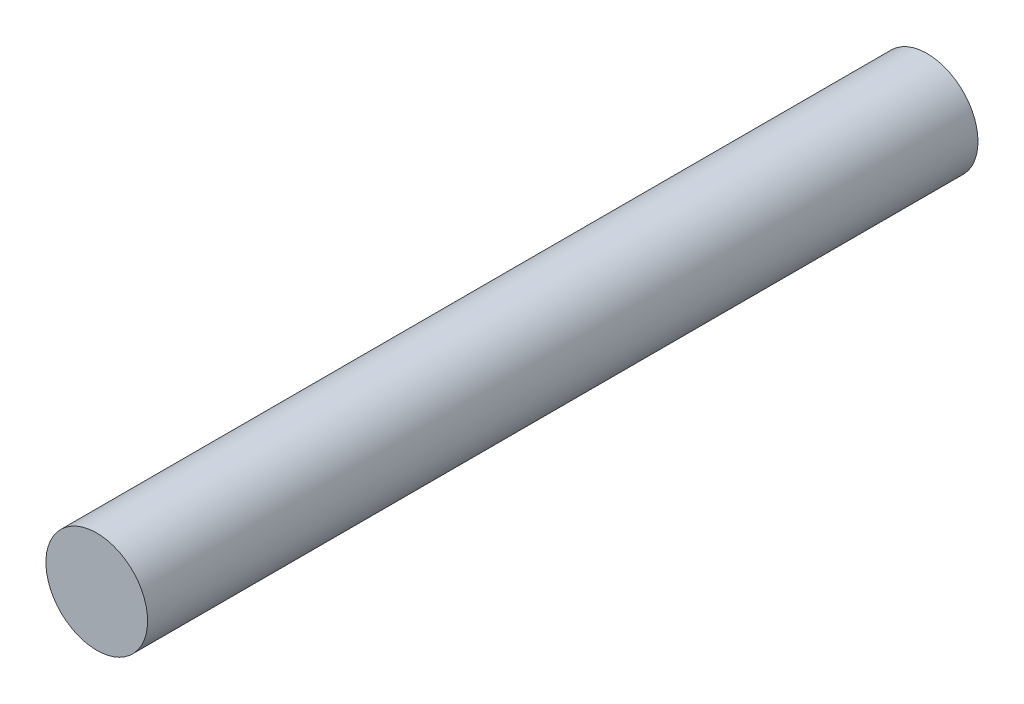
ISO-10303-21;
HEADER;
FILE_DESCRIPTION(('STEP AP214'),'2;1');
FILE_NAME('part.step','',(''),(''),'','','');
FILE_SCHEMA(('AUTOMOTIVE_DESIGN { 1 0 10303 214 1 1 1 1 }'));
ENDSEC;
DATA;
#1=APPLICATION_CONTEXT('core data for automotive mechanical design processes');
#2=APPLICATION_PROTOCOL_DEFINITION('international standard','automotive_design',2000,#1);
#3=PRODUCT_CONTEXT('',#1,'mechanical');
#4=PRODUCT('Part','Part','',(#3));
#5=PRODUCT_RELATED_PRODUCT_CATEGORY('part','',(#4));
#6=PRODUCT_DEFINITION_FORMATION('','',#4);
#7=PRODUCT_DEFINITION_CONTEXT('part definition',#1,'design');
#8=PRODUCT_DEFINITION('design','',#6,#7);
#9=PRODUCT_DEFINITION_SHAPE('','',#8);
#10=(LENGTH_UNIT() NAMED_UNIT(*) SI_UNIT(.MILLI.,.METRE.));
#11=(NAMED_UNIT(*) PLANE_ANGLE_UNIT() SI_UNIT($,.RADIAN.));
#12=(NAMED_UNIT(*) SI_UNIT($,.STERADIAN.) SOLID_ANGLE_UNIT());
#13=UNCERTAINTY_MEASURE_WITH_UNIT(LENGTH_MEASURE(1.E-05),#10,'distance_accuracy_value','');
#14=(GEOMETRIC_REPRESENTATION_CONTEXT(3) GLOBAL_UNCERTAINTY_ASSIGNED_CONTEXT((#13)) GLOBAL_UNIT_ASSIGNED_CONTEXT((#10,
#11,#12)) REPRESENTATION_CONTEXT('',''));
#15=CARTESIAN_POINT('',(0.,0.,0.));
#16=DIRECTION('',(0.,0.,1.));
#17=DIRECTION('',(1.,0.,0.));
#18=AXIS2_PLACEMENT_3D('',#15,#16,#17);
#19=CARTESIAN_POINT('',(120.626428164449,379.178369402645,24.5));
#20=DIRECTION('',(0.,0.,-1.));
#21=DIRECTION('',(-1.,0.,0.));
#22=AXIS2_PLACEMENT_3D('',#19,#20,#21);
#23=PLANE('',#22);
#24=CARTESIAN_POINT('',(120.626428164449,379.178369402645,24.5));
#25=DIRECTION('',(0.,0.,1.));
#26=DIRECTION('',(1.,0.,0.));
#27=AXIS2_PLACEMENT_3D('',#24,#25,#26);
#28=CIRCLE('',#27,1.5);
#29=CARTESIAN_POINT('',(122.126428164449,379.178369402645,24.5));
#30=VERTEX_POINT('',#29);
#31=EDGE_CURVE('E18',#30,#30,#28,.F.);
#32=ORIENTED_EDGE('',*,*,#31,.F.);
#33=EDGE_LOOP('',(#32));
#34=FACE_BOUND('',#33,.T.);
#35=ADVANCED_FACE('F15',(#34),#23,.F.);
#36=CARTESIAN_POINT('',(120.626428164449,379.178369402645,0.));
#37=DIRECTION('',(0.,0.,-1.));
#38=DIRECTION('',(-1.,0.,0.));
#39=AXIS2_PLACEMENT_3D('',#36,#37,#38);
#40=PLANE('',#39);
#41=CARTESIAN_POINT('',(120.626428164449,379.178369402645,0.));
#42=DIRECTION('',(0.,0.,1.));
#43=DIRECTION('',(1.,0.,0.));
#44=AXIS2_PLACEMENT_3D('',#41,#42,#43);
#45=CIRCLE('',#44,1.5);
#46=CARTESIAN_POINT('',(122.126428164449,379.178369402645,0.));
#47=VERTEX_POINT('',#46);
#48=EDGE_CURVE('E10',#47,#47,#45,.T.);
#49=ORIENTED_EDGE('',*,*,#48,.F.);
#50=EDGE_LOOP('',(#49));
#51=FACE_BOUND('',#50,.T.);
#52=ADVANCED_FACE('F30',(#51),#40,.T.);
#53=CARTESIAN_POINT('',(120.626428164449,379.178369402645,24.5));
#54=DIRECTION('',(0.,0.,1.));
#55=DIRECTION('',(1.,0.,0.));
#56=AXIS2_PLACEMENT_3D('',#53,#54,#55);
#57=CYLINDRICAL_SURFACE('',#56,1.5);
#58=ORIENTED_EDGE('',*,*,#48,.T.);
#59=EDGE_LOOP('',(#58));
#60=FACE_BOUND('',#59,.T.);
#61=ORIENTED_EDGE('',*,*,#31,.T.);
#62=EDGE_LOOP('',(#61));
#63=FACE_BOUND('',#62,.T.);
#64=ADVANCED_FACE('F27',(#60,#63),#57,.T.);
#65=CLOSED_SHELL('',(#35,#52,#64));
#66=MANIFOLD_SOLID_BREP('B1',#65);
#67=ADVANCED_BREP_SHAPE_REPRESENTATION('',(#18,#66),#14);
#68=SHAPE_DEFINITION_REPRESENTATION(#9,#67);
ENDSEC;
END-ISO-10303-21;
